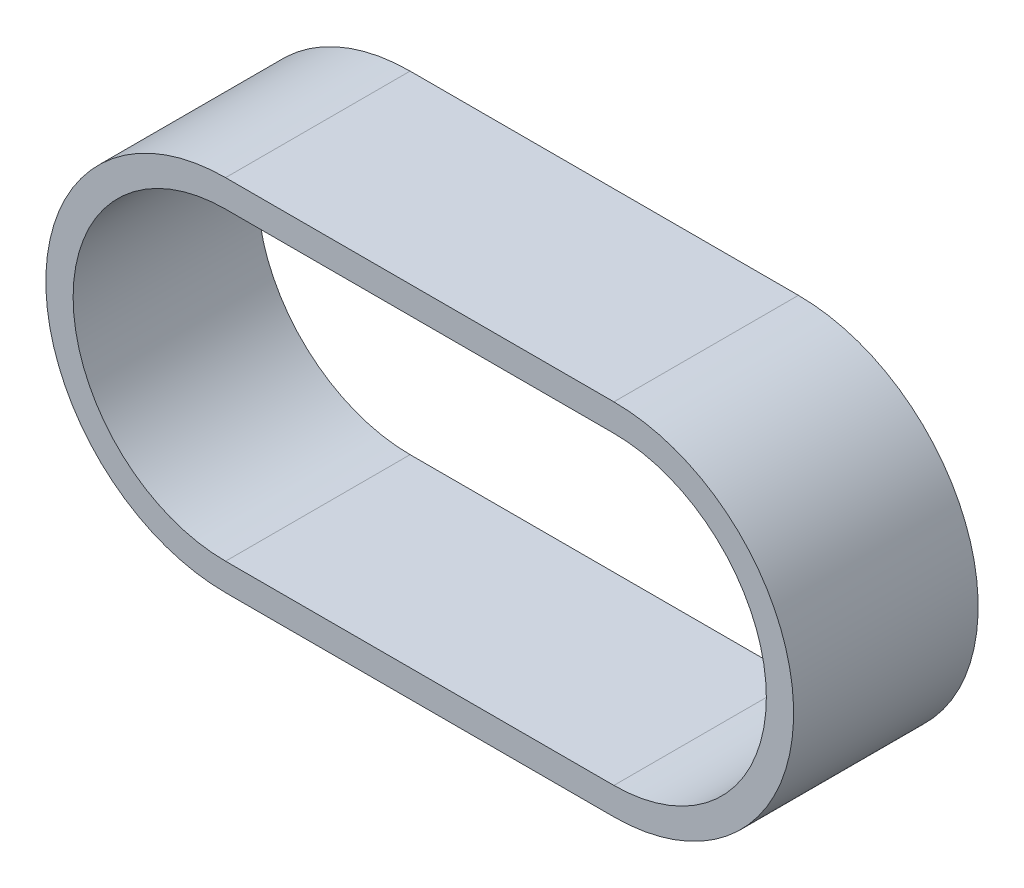
ISO-10303-21;
HEADER;
FILE_DESCRIPTION(('STEP AP214'),'2;1');
FILE_NAME('part.step','',(''),(''),'','','');
FILE_SCHEMA(('AUTOMOTIVE_DESIGN { 1 0 10303 214 1 1 1 1 }'));
ENDSEC;
DATA;
#1=APPLICATION_CONTEXT('core data for automotive mechanical design processes');
#2=APPLICATION_PROTOCOL_DEFINITION('international standard','automotive_design',2000,#1);
#3=PRODUCT_CONTEXT('',#1,'mechanical');
#4=PRODUCT('Part','Part','',(#3));
#5=PRODUCT_RELATED_PRODUCT_CATEGORY('part','',(#4));
#6=PRODUCT_DEFINITION_FORMATION('','',#4);
#7=PRODUCT_DEFINITION_CONTEXT('part definition',#1,'design');
#8=PRODUCT_DEFINITION('design','',#6,#7);
#9=PRODUCT_DEFINITION_SHAPE('','',#8);
#10=(LENGTH_UNIT() NAMED_UNIT(*) SI_UNIT(.MILLI.,.METRE.));
#11=(NAMED_UNIT(*) PLANE_ANGLE_UNIT() SI_UNIT($,.RADIAN.));
#12=(NAMED_UNIT(*) SI_UNIT($,.STERADIAN.) SOLID_ANGLE_UNIT());
#13=UNCERTAINTY_MEASURE_WITH_UNIT(LENGTH_MEASURE(1.E-05),#10,'distance_accuracy_value','');
#14=(GEOMETRIC_REPRESENTATION_CONTEXT(3) GLOBAL_UNCERTAINTY_ASSIGNED_CONTEXT((#13)) GLOBAL_UNIT_ASSIGNED_CONTEXT((#10,
#11,#12)) REPRESENTATION_CONTEXT('',''));
#15=CARTESIAN_POINT('',(0.,0.,0.));
#16=DIRECTION('',(0.,0.,1.));
#17=DIRECTION('',(1.,0.,0.));
#18=AXIS2_PLACEMENT_3D('',#15,#16,#17);
#19=CARTESIAN_POINT('',(-121.,0.,115.));
#20=DIRECTION('',(0.,0.,1.));
#21=DIRECTION('',(1.,0.,0.));
#22=AXIS2_PLACEMENT_3D('',#19,#20,#21);
#23=PLANE('',#22);
#24=CARTESIAN_POINT('',(-121.,0.,115.));
#25=DIRECTION('',(0.,0.,1.));
#26=DIRECTION('',(1.,0.,0.));
#27=AXIS2_PLACEMENT_3D('',#24,#25,#26);
#28=CIRCLE('',#27,112.);
#29=CARTESIAN_POINT('',(-121.,112.,115.));
#30=VERTEX_POINT('',#29);
#31=CARTESIAN_POINT('',(-121.,-112.,115.));
#32=VERTEX_POINT('',#31);
#33=EDGE_CURVE('E140',#30,#32,#28,.T.);
#34=ORIENTED_EDGE('',*,*,#33,.T.);
#35=DIRECTION('',(1.,0.,0.));
#36=VECTOR('',#35,1.);
#37=CARTESIAN_POINT('',(-121.,-112.,115.));
#38=LINE('',#37,#36);
#39=CARTESIAN_POINT('',(121.,-112.,115.));
#40=VERTEX_POINT('',#39);
#41=EDGE_CURVE('E143',#32,#40,#38,.T.);
#42=ORIENTED_EDGE('',*,*,#41,.T.);
#43=CARTESIAN_POINT('',(121.,0.,115.));
#44=DIRECTION('',(0.,0.,1.));
#45=DIRECTION('',(1.,0.,0.));
#46=AXIS2_PLACEMENT_3D('',#43,#44,#45);
#47=CIRCLE('',#46,112.);
#48=CARTESIAN_POINT('',(121.,112.,115.));
#49=VERTEX_POINT('',#48);
#50=EDGE_CURVE('E146',#40,#49,#47,.T.);
#51=ORIENTED_EDGE('',*,*,#50,.T.);
#52=DIRECTION('',(-1.,0.,0.));
#53=VECTOR('',#52,1.);
#54=CARTESIAN_POINT('',(-121.,112.,115.));
#55=LINE('',#54,#53);
#56=EDGE_CURVE('E148',#49,#30,#55,.T.);
#57=ORIENTED_EDGE('',*,*,#56,.T.);
#58=EDGE_LOOP('',(#34,#42,#51,#57));
#59=FACE_BOUND('',#58,.T.);
#60=DIRECTION('',(1.,0.,0.));
#61=VECTOR('',#60,1.);
#62=CARTESIAN_POINT('',(-121.,-95.,115.));
#63=LINE('',#62,#61);
#64=CARTESIAN_POINT('',(-121.,-95.,115.));
#65=VERTEX_POINT('',#64);
#66=CARTESIAN_POINT('',(121.,-95.,115.));
#67=VERTEX_POINT('',#66);
#68=EDGE_CURVE('E112',#65,#67,#63,.T.);
#69=ORIENTED_EDGE('',*,*,#68,.F.);
#70=CARTESIAN_POINT('',(-121.,0.,115.));
#71=DIRECTION('',(0.,0.,1.));
#72=DIRECTION('',(1.,0.,0.));
#73=AXIS2_PLACEMENT_3D('',#70,#71,#72);
#74=CIRCLE('',#73,95.);
#75=CARTESIAN_POINT('',(-121.,95.,115.));
#76=VERTEX_POINT('',#75);
#77=EDGE_CURVE('E104',#76,#65,#74,.T.);
#78=ORIENTED_EDGE('',*,*,#77,.F.);
#79=DIRECTION('',(-1.,0.,0.));
#80=VECTOR('',#79,1.);
#81=CARTESIAN_POINT('',(-121.,95.,115.));
#82=LINE('',#81,#80);
#83=CARTESIAN_POINT('',(121.,95.0000000000001,115.));
#84=VERTEX_POINT('',#83);
#85=EDGE_CURVE('E126',#84,#76,#82,.T.);
#86=ORIENTED_EDGE('',*,*,#85,.F.);
#87=CARTESIAN_POINT('',(121.,0.,115.));
#88=DIRECTION('',(0.,0.,1.));
#89=DIRECTION('',(1.,0.,0.));
#90=AXIS2_PLACEMENT_3D('',#87,#88,#89);
#91=CIRCLE('',#90,95.);
#92=EDGE_CURVE('E124',#67,#84,#91,.T.);
#93=ORIENTED_EDGE('',*,*,#92,.F.);
#94=EDGE_LOOP('',(#69,#78,#86,#93));
#95=FACE_BOUND('',#94,.T.);
#96=ADVANCED_FACE('F39',(#59,#95),#23,.T.);
#97=CARTESIAN_POINT('',(-121.,0.,0.));
#98=DIRECTION('',(0.,0.,1.));
#99=DIRECTION('',(1.,0.,0.));
#100=AXIS2_PLACEMENT_3D('',#97,#98,#99);
#101=PLANE('',#100);
#102=CARTESIAN_POINT('',(-121.,0.,0.));
#103=DIRECTION('',(0.,0.,1.));
#104=DIRECTION('',(1.,0.,0.));
#105=AXIS2_PLACEMENT_3D('',#102,#103,#104);
#106=CIRCLE('',#105,112.);
#107=CARTESIAN_POINT('',(-121.,112.,0.));
#108=VERTEX_POINT('',#107);
#109=CARTESIAN_POINT('',(-121.,-112.,0.));
#110=VERTEX_POINT('',#109);
#111=EDGE_CURVE('E120',#108,#110,#106,.T.);
#112=ORIENTED_EDGE('',*,*,#111,.F.);
#113=DIRECTION('',(-1.,0.,0.));
#114=VECTOR('',#113,1.);
#115=CARTESIAN_POINT('',(-121.,112.,0.));
#116=LINE('',#115,#114);
#117=CARTESIAN_POINT('',(121.,112.,0.));
#118=VERTEX_POINT('',#117);
#119=EDGE_CURVE('E144',#118,#108,#116,.T.);
#120=ORIENTED_EDGE('',*,*,#119,.F.);
#121=CARTESIAN_POINT('',(121.,0.,0.));
#122=DIRECTION('',(0.,0.,1.));
#123=DIRECTION('',(1.,0.,0.));
#124=AXIS2_PLACEMENT_3D('',#121,#122,#123);
#125=CIRCLE('',#124,112.);
#126=CARTESIAN_POINT('',(121.,-112.,0.));
#127=VERTEX_POINT('',#126);
#128=EDGE_CURVE('E155',#127,#118,#125,.T.);
#129=ORIENTED_EDGE('',*,*,#128,.F.);
#130=DIRECTION('',(1.,0.,0.));
#131=VECTOR('',#130,1.);
#132=CARTESIAN_POINT('',(-121.,-112.,0.));
#133=LINE('',#132,#131);
#134=EDGE_CURVE('E153',#110,#127,#133,.T.);
#135=ORIENTED_EDGE('',*,*,#134,.F.);
#136=EDGE_LOOP('',(#112,#120,#129,#135));
#137=FACE_BOUND('',#136,.T.);
#138=CARTESIAN_POINT('',(-121.,0.,0.));
#139=DIRECTION('',(0.,0.,1.));
#140=DIRECTION('',(1.,0.,0.));
#141=AXIS2_PLACEMENT_3D('',#138,#139,#140);
#142=CIRCLE('',#141,95.);
#143=CARTESIAN_POINT('',(-121.,95.,0.));
#144=VERTEX_POINT('',#143);
#145=CARTESIAN_POINT('',(-121.,-95.,0.));
#146=VERTEX_POINT('',#145);
#147=EDGE_CURVE('E62',#144,#146,#142,.T.);
#148=ORIENTED_EDGE('',*,*,#147,.T.);
#149=DIRECTION('',(1.,0.,0.));
#150=VECTOR('',#149,1.);
#151=CARTESIAN_POINT('',(-121.,-95.,0.));
#152=LINE('',#151,#150);
#153=CARTESIAN_POINT('',(121.,-95.,0.));
#154=VERTEX_POINT('',#153);
#155=EDGE_CURVE('E119',#146,#154,#152,.T.);
#156=ORIENTED_EDGE('',*,*,#155,.T.);
#157=CARTESIAN_POINT('',(121.,0.,0.));
#158=DIRECTION('',(0.,0.,1.));
#159=DIRECTION('',(1.,0.,0.));
#160=AXIS2_PLACEMENT_3D('',#157,#158,#159);
#161=CIRCLE('',#160,95.);
#162=CARTESIAN_POINT('',(121.,95.0000000000001,0.));
#163=VERTEX_POINT('',#162);
#164=EDGE_CURVE('E132',#154,#163,#161,.T.);
#165=ORIENTED_EDGE('',*,*,#164,.T.);
#166=DIRECTION('',(-1.,0.,0.));
#167=VECTOR('',#166,1.);
#168=CARTESIAN_POINT('',(-121.,95.,0.));
#169=LINE('',#168,#167);
#170=EDGE_CURVE('E113',#163,#144,#169,.T.);
#171=ORIENTED_EDGE('',*,*,#170,.T.);
#172=EDGE_LOOP('',(#148,#156,#165,#171));
#173=FACE_BOUND('',#172,.T.);
#174=ADVANCED_FACE('F173',(#137,#173),#101,.F.);
#175=CARTESIAN_POINT('',(-121.,0.,115.));
#176=DIRECTION('',(0.,0.,-1.));
#177=DIRECTION('',(-1.,0.,0.));
#178=AXIS2_PLACEMENT_3D('',#175,#176,#177);
#179=CYLINDRICAL_SURFACE('',#178,112.);
#180=ORIENTED_EDGE('',*,*,#111,.T.);
#181=DIRECTION('',(0.,0.,-1.));
#182=VECTOR('',#181,1.);
#183=CARTESIAN_POINT('',(-121.,-112.,115.));
#184=LINE('',#183,#182);
#185=EDGE_CURVE('E11',#32,#110,#184,.T.);
#186=ORIENTED_EDGE('',*,*,#185,.F.);
#187=ORIENTED_EDGE('',*,*,#33,.F.);
#188=DIRECTION('',(0.,0.,-1.));
#189=VECTOR('',#188,1.);
#190=CARTESIAN_POINT('',(-121.,112.,115.));
#191=LINE('',#190,#189);
#192=EDGE_CURVE('E150',#30,#108,#191,.T.);
#193=ORIENTED_EDGE('',*,*,#192,.T.);
#194=EDGE_LOOP('',(#180,#186,#187,#193));
#195=FACE_BOUND('',#194,.T.);
#196=ADVANCED_FACE('F41',(#195),#179,.T.);
#197=CARTESIAN_POINT('',(-121.,-112.,115.));
#198=DIRECTION('',(0.,1.,0.));
#199=DIRECTION('',(-1.,0.,0.));
#200=AXIS2_PLACEMENT_3D('',#197,#198,#199);
#201=PLANE('',#200);
#202=ORIENTED_EDGE('',*,*,#134,.T.);
#203=DIRECTION('',(0.,0.,-1.));
#204=VECTOR('',#203,1.);
#205=CARTESIAN_POINT('',(121.,-112.,115.));
#206=LINE('',#205,#204);
#207=EDGE_CURVE('E47',#40,#127,#206,.T.);
#208=ORIENTED_EDGE('',*,*,#207,.F.);
#209=ORIENTED_EDGE('',*,*,#41,.F.);
#210=ORIENTED_EDGE('',*,*,#185,.T.);
#211=EDGE_LOOP('',(#202,#208,#209,#210));
#212=FACE_BOUND('',#211,.T.);
#213=ADVANCED_FACE('F183',(#212),#201,.F.);
#214=CARTESIAN_POINT('',(121.,0.,115.));
#215=DIRECTION('',(0.,0.,-1.));
#216=DIRECTION('',(-1.,0.,0.));
#217=AXIS2_PLACEMENT_3D('',#214,#215,#216);
#218=CYLINDRICAL_SURFACE('',#217,112.);
#219=ORIENTED_EDGE('',*,*,#128,.T.);
#220=DIRECTION('',(0.,0.,-1.));
#221=VECTOR('',#220,1.);
#222=CARTESIAN_POINT('',(121.,112.,115.));
#223=LINE('',#222,#221);
#224=EDGE_CURVE('E160',#49,#118,#223,.T.);
#225=ORIENTED_EDGE('',*,*,#224,.F.);
#226=ORIENTED_EDGE('',*,*,#50,.F.);
#227=ORIENTED_EDGE('',*,*,#207,.T.);
#228=EDGE_LOOP('',(#219,#225,#226,#227));
#229=FACE_BOUND('',#228,.T.);
#230=ADVANCED_FACE('F167',(#229),#218,.T.);
#231=CARTESIAN_POINT('',(-121.,112.,115.));
#232=DIRECTION('',(0.,-1.,0.));
#233=DIRECTION('',(1.,0.,0.));
#234=AXIS2_PLACEMENT_3D('',#231,#232,#233);
#235=PLANE('',#234);
#236=ORIENTED_EDGE('',*,*,#119,.T.);
#237=ORIENTED_EDGE('',*,*,#192,.F.);
#238=ORIENTED_EDGE('',*,*,#56,.F.);
#239=ORIENTED_EDGE('',*,*,#224,.T.);
#240=EDGE_LOOP('',(#236,#237,#238,#239));
#241=FACE_BOUND('',#240,.T.);
#242=ADVANCED_FACE('F177',(#241),#235,.F.);
#243=CARTESIAN_POINT('',(-121.,0.,115.));
#244=DIRECTION('',(0.,0.,-1.));
#245=DIRECTION('',(-1.,0.,0.));
#246=AXIS2_PLACEMENT_3D('',#243,#244,#245);
#247=CYLINDRICAL_SURFACE('',#246,95.);
#248=ORIENTED_EDGE('',*,*,#147,.F.);
#249=DIRECTION('',(0.,0.,-1.));
#250=VECTOR('',#249,1.);
#251=CARTESIAN_POINT('',(-121.,95.,115.));
#252=LINE('',#251,#250);
#253=EDGE_CURVE('E108',#76,#144,#252,.T.);
#254=ORIENTED_EDGE('',*,*,#253,.F.);
#255=ORIENTED_EDGE('',*,*,#77,.T.);
#256=DIRECTION('',(0.,0.,-1.));
#257=VECTOR('',#256,1.);
#258=CARTESIAN_POINT('',(-121.,-95.,115.));
#259=LINE('',#258,#257);
#260=EDGE_CURVE('E107',#65,#146,#259,.T.);
#261=ORIENTED_EDGE('',*,*,#260,.T.);
#262=EDGE_LOOP('',(#248,#254,#255,#261));
#263=FACE_BOUND('',#262,.T.);
#264=ADVANCED_FACE('F106',(#263),#247,.F.);
#265=CARTESIAN_POINT('',(-121.,-95.,115.));
#266=DIRECTION('',(0.,1.,0.));
#267=DIRECTION('',(-1.,0.,0.));
#268=AXIS2_PLACEMENT_3D('',#265,#266,#267);
#269=PLANE('',#268);
#270=ORIENTED_EDGE('',*,*,#155,.F.);
#271=ORIENTED_EDGE('',*,*,#260,.F.);
#272=ORIENTED_EDGE('',*,*,#68,.T.);
#273=DIRECTION('',(0.,0.,-1.));
#274=VECTOR('',#273,1.);
#275=CARTESIAN_POINT('',(121.,-95.,115.));
#276=LINE('',#275,#274);
#277=EDGE_CURVE('E121',#67,#154,#276,.T.);
#278=ORIENTED_EDGE('',*,*,#277,.T.);
#279=EDGE_LOOP('',(#270,#271,#272,#278));
#280=FACE_BOUND('',#279,.T.);
#281=ADVANCED_FACE('F116',(#280),#269,.T.);
#282=CARTESIAN_POINT('',(121.,0.,115.));
#283=DIRECTION('',(0.,0.,-1.));
#284=DIRECTION('',(-1.,0.,0.));
#285=AXIS2_PLACEMENT_3D('',#282,#283,#284);
#286=CYLINDRICAL_SURFACE('',#285,95.);
#287=ORIENTED_EDGE('',*,*,#164,.F.);
#288=ORIENTED_EDGE('',*,*,#277,.F.);
#289=ORIENTED_EDGE('',*,*,#92,.T.);
#290=DIRECTION('',(0.,0.,-1.));
#291=VECTOR('',#290,1.);
#292=CARTESIAN_POINT('',(121.,95.0000000000001,115.));
#293=LINE('',#292,#291);
#294=EDGE_CURVE('E54',#84,#163,#293,.T.);
#295=ORIENTED_EDGE('',*,*,#294,.T.);
#296=EDGE_LOOP('',(#287,#288,#289,#295));
#297=FACE_BOUND('',#296,.T.);
#298=ADVANCED_FACE('F206',(#297),#286,.F.);
#299=CARTESIAN_POINT('',(-121.,95.,115.));
#300=DIRECTION('',(0.,-1.,0.));
#301=DIRECTION('',(1.,0.,0.));
#302=AXIS2_PLACEMENT_3D('',#299,#300,#301);
#303=PLANE('',#302);
#304=ORIENTED_EDGE('',*,*,#170,.F.);
#305=ORIENTED_EDGE('',*,*,#294,.F.);
#306=ORIENTED_EDGE('',*,*,#85,.T.);
#307=ORIENTED_EDGE('',*,*,#253,.T.);
#308=EDGE_LOOP('',(#304,#305,#306,#307));
#309=FACE_BOUND('',#308,.T.);
#310=ADVANCED_FACE('F210',(#309),#303,.T.);
#311=CLOSED_SHELL('',(#96,#174,#196,#213,#230,#242,#264,#281,#298,#310));
#312=MANIFOLD_SOLID_BREP('B2',#311);
#313=ADVANCED_BREP_SHAPE_REPRESENTATION('',(#18,#312),#14);
#314=SHAPE_DEFINITION_REPRESENTATION(#9,#313);
ENDSEC;
END-ISO-10303-21;
